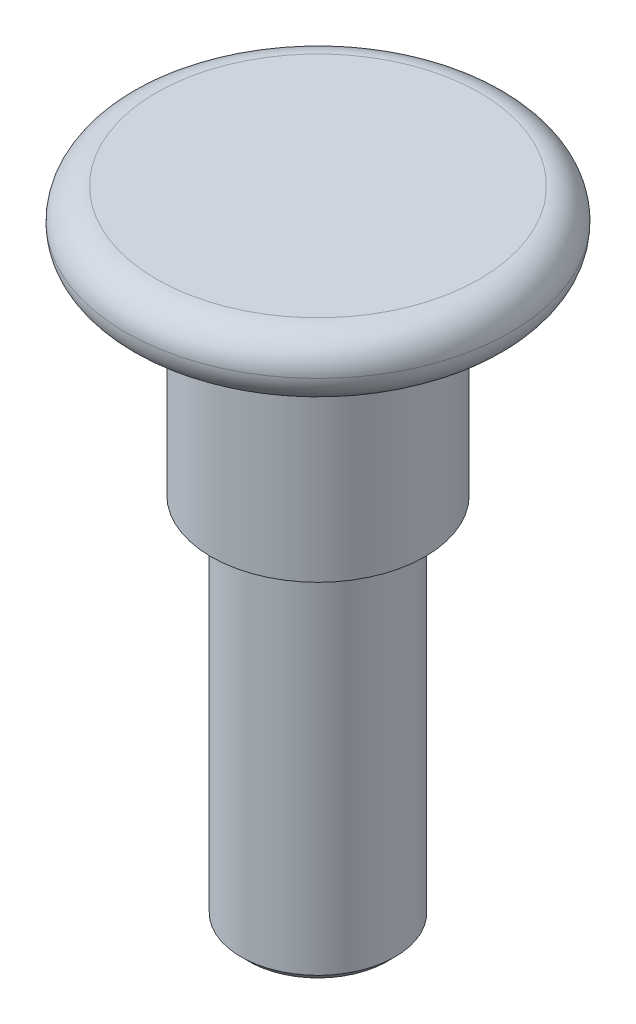
ISO-10303-21;
HEADER;
FILE_DESCRIPTION(('STEP AP214'),'2;1');
FILE_NAME('part.step','',(''),(''),'','','');
FILE_SCHEMA(('AUTOMOTIVE_DESIGN { 1 0 10303 214 1 1 1 1 }'));
ENDSEC;
DATA;
#1=APPLICATION_CONTEXT('core data for automotive mechanical design processes');
#2=APPLICATION_PROTOCOL_DEFINITION('international standard','automotive_design',2000,#1);
#3=PRODUCT_CONTEXT('',#1,'mechanical');
#4=PRODUCT('Part','Part','',(#3));
#5=PRODUCT_RELATED_PRODUCT_CATEGORY('part','',(#4));
#6=PRODUCT_DEFINITION_FORMATION('','',#4);
#7=PRODUCT_DEFINITION_CONTEXT('part definition',#1,'design');
#8=PRODUCT_DEFINITION('design','',#6,#7);
#9=PRODUCT_DEFINITION_SHAPE('','',#8);
#10=(LENGTH_UNIT() NAMED_UNIT(*) SI_UNIT(.MILLI.,.METRE.));
#11=(NAMED_UNIT(*) PLANE_ANGLE_UNIT() SI_UNIT($,.RADIAN.));
#12=(NAMED_UNIT(*) SI_UNIT($,.STERADIAN.) SOLID_ANGLE_UNIT());
#13=UNCERTAINTY_MEASURE_WITH_UNIT(LENGTH_MEASURE(1.E-05),#10,'distance_accuracy_value','');
#14=(GEOMETRIC_REPRESENTATION_CONTEXT(3) GLOBAL_UNCERTAINTY_ASSIGNED_CONTEXT((#13)) GLOBAL_UNIT_ASSIGNED_CONTEXT((#10,
#11,#12)) REPRESENTATION_CONTEXT('',''));
#15=CARTESIAN_POINT('',(0.,0.,0.));
#16=DIRECTION('',(0.,0.,1.));
#17=DIRECTION('',(1.,0.,0.));
#18=AXIS2_PLACEMENT_3D('',#15,#16,#17);
#19=CARTESIAN_POINT('',(0.,57.5016057585825,0.));
#20=DIRECTION('',(0.,1.,0.));
#21=DIRECTION('',(0.,0.,1.));
#22=AXIS2_PLACEMENT_3D('',#19,#20,#21);
#23=PLANE('',#22);
#24=CARTESIAN_POINT('',(0.,57.5016057585825,0.));
#25=DIRECTION('',(0.,1.,0.));
#26=DIRECTION('',(0.,0.,1.));
#27=AXIS2_PLACEMENT_3D('',#24,#25,#26);
#28=CIRCLE('',#27,10.5);
#29=CARTESIAN_POINT('',(0.,57.5016057585825,10.5));
#30=VERTEX_POINT('',#29);
#31=EDGE_CURVE('E42',#30,#30,#28,.T.);
#32=ORIENTED_EDGE('',*,*,#31,.T.);
#33=EDGE_LOOP('',(#32));
#34=FACE_BOUND('',#33,.T.);
#35=ADVANCED_FACE('F31',(#34),#23,.T.);
#36=CARTESIAN_POINT('',(12.5,53.5016057585825,0.));
#37=DIRECTION('',(0.,-1.,0.));
#38=DIRECTION('',(0.,0.,-1.));
#39=AXIS2_PLACEMENT_3D('',#36,#37,#38);
#40=PLANE('',#39);
#41=CARTESIAN_POINT('',(0.,53.5016057585825,0.));
#42=DIRECTION('',(0.,-1.,0.));
#43=DIRECTION('',(0.,0.,-1.));
#44=AXIS2_PLACEMENT_3D('',#41,#42,#43);
#45=CIRCLE('',#44,10.5);
#46=CARTESIAN_POINT('',(0.,53.5016057585825,-10.5));
#47=VERTEX_POINT('',#46);
#48=EDGE_CURVE('E46',#47,#47,#45,.T.);
#49=ORIENTED_EDGE('',*,*,#48,.T.);
#50=EDGE_LOOP('',(#49));
#51=FACE_BOUND('',#50,.T.);
#52=CARTESIAN_POINT('',(0.,53.5016057585825,0.));
#53=DIRECTION('',(0.,-1.,0.));
#54=DIRECTION('',(0.,0.,-1.));
#55=AXIS2_PLACEMENT_3D('',#52,#53,#54);
#56=CIRCLE('',#55,6.95);
#57=CARTESIAN_POINT('',(0.,53.5016057585825,-6.95));
#58=VERTEX_POINT('',#57);
#59=EDGE_CURVE('E55',#58,#58,#56,.T.);
#60=ORIENTED_EDGE('',*,*,#59,.F.);
#61=EDGE_LOOP('',(#60));
#62=FACE_BOUND('',#61,.T.);
#63=ADVANCED_FACE('F77',(#51,#62),#40,.T.);
#64=CARTESIAN_POINT('',(0.,-51.2852159468438,0.));
#65=DIRECTION('',(0.,-1.,0.));
#66=DIRECTION('',(0.,0.,-1.));
#67=AXIS2_PLACEMENT_3D('',#64,#65,#66);
#68=CYLINDRICAL_SURFACE('',#67,6.95);
#69=ORIENTED_EDGE('',*,*,#59,.T.);
#70=EDGE_LOOP('',(#69));
#71=FACE_BOUND('',#70,.T.);
#72=CARTESIAN_POINT('',(0.,40.1016057585825,0.));
#73=DIRECTION('',(0.,-1.,0.));
#74=DIRECTION('',(0.,0.,-1.));
#75=AXIS2_PLACEMENT_3D('',#72,#73,#74);
#76=CIRCLE('',#75,6.95);
#77=CARTESIAN_POINT('',(0.,40.1016057585825,-6.95));
#78=VERTEX_POINT('',#77);
#79=EDGE_CURVE('E58',#78,#78,#76,.T.);
#80=ORIENTED_EDGE('',*,*,#79,.F.);
#81=EDGE_LOOP('',(#80));
#82=FACE_BOUND('',#81,.T.);
#83=ADVANCED_FACE('F68',(#71,#82),#68,.T.);
#84=CARTESIAN_POINT('',(6.95,40.1016057585825,0.));
#85=DIRECTION('',(0.,-1.,0.));
#86=DIRECTION('',(0.,0.,-1.));
#87=AXIS2_PLACEMENT_3D('',#84,#85,#86);
#88=PLANE('',#87);
#89=ORIENTED_EDGE('',*,*,#79,.T.);
#90=EDGE_LOOP('',(#89));
#91=FACE_BOUND('',#90,.T.);
#92=CARTESIAN_POINT('',(0.,40.1016057585825,0.));
#93=DIRECTION('',(0.,-1.,0.));
#94=DIRECTION('',(0.,0.,-1.));
#95=AXIS2_PLACEMENT_3D('',#92,#93,#94);
#96=CIRCLE('',#95,5.);
#97=CARTESIAN_POINT('',(0.,40.1016057585825,-5.));
#98=VERTEX_POINT('',#97);
#99=EDGE_CURVE('E51',#98,#98,#96,.T.);
#100=ORIENTED_EDGE('',*,*,#99,.F.);
#101=EDGE_LOOP('',(#100));
#102=FACE_BOUND('',#101,.T.);
#103=ADVANCED_FACE('F66',(#91,#102),#88,.T.);
#104=CARTESIAN_POINT('',(0.,-51.2852159468438,0.));
#105=DIRECTION('',(0.,-1.,0.));
#106=DIRECTION('',(0.,0.,-1.));
#107=AXIS2_PLACEMENT_3D('',#104,#105,#106);
#108=CYLINDRICAL_SURFACE('',#107,5.);
#109=CARTESIAN_POINT('',(0.,16.6016057585825,0.));
#110=DIRECTION('',(0.,-1.,0.));
#111=DIRECTION('',(0.,0.,-1.));
#112=AXIS2_PLACEMENT_3D('',#109,#110,#111);
#113=CIRCLE('',#112,5.);
#114=CARTESIAN_POINT('',(0.,16.6016057585825,-5.));
#115=VERTEX_POINT('',#114);
#116=EDGE_CURVE('E10',#115,#115,#113,.F.);
#117=ORIENTED_EDGE('',*,*,#116,.T.);
#118=EDGE_LOOP('',(#117));
#119=FACE_BOUND('',#118,.T.);
#120=ORIENTED_EDGE('',*,*,#99,.T.);
#121=EDGE_LOOP('',(#120));
#122=FACE_BOUND('',#121,.T.);
#123=ADVANCED_FACE('F64',(#119,#122),#108,.T.);
#124=CARTESIAN_POINT('',(5.,16.1016057585825,0.));
#125=DIRECTION('',(0.,-1.,0.));
#126=DIRECTION('',(0.,0.,-1.));
#127=AXIS2_PLACEMENT_3D('',#124,#125,#126);
#128=PLANE('',#127);
#129=CARTESIAN_POINT('',(0.,16.1016057585825,0.));
#130=DIRECTION('',(0.,-1.,0.));
#131=DIRECTION('',(0.,0.,-1.));
#132=AXIS2_PLACEMENT_3D('',#129,#130,#131);
#133=CIRCLE('',#132,4.5);
#134=CARTESIAN_POINT('',(0.,16.1016057585825,-4.5));
#135=VERTEX_POINT('',#134);
#136=EDGE_CURVE('E38',#135,#135,#133,.T.);
#137=ORIENTED_EDGE('',*,*,#136,.T.);
#138=EDGE_LOOP('',(#137));
#139=FACE_BOUND('',#138,.T.);
#140=ADVANCED_FACE('F75',(#139),#128,.T.);
#141=CARTESIAN_POINT('',(0.,55.5016057585825,0.));
#142=DIRECTION('',(0.,1.,0.));
#143=DIRECTION('',(0.,0.,1.));
#144=AXIS2_PLACEMENT_3D('',#141,#142,#143);
#145=TOROIDAL_SURFACE('',#144,10.5,2.);
#146=ORIENTED_EDGE('',*,*,#31,.F.);
#147=EDGE_LOOP('',(#146));
#148=FACE_BOUND('',#147,.T.);
#149=CARTESIAN_POINT('',(0.,55.5016057585825,0.));
#150=DIRECTION('',(0.,1.,0.));
#151=DIRECTION('',(0.,0.,1.));
#152=AXIS2_PLACEMENT_3D('',#149,#150,#151);
#153=CIRCLE('',#152,12.5);
#154=CARTESIAN_POINT('',(0.,55.5016057585825,12.5));
#155=VERTEX_POINT('',#154);
#156=EDGE_CURVE('E49',#155,#155,#153,.F.);
#157=ORIENTED_EDGE('',*,*,#156,.F.);
#158=EDGE_LOOP('',(#157));
#159=FACE_BOUND('',#158,.T.);
#160=ADVANCED_FACE('F91',(#148,#159),#145,.T.);
#161=CARTESIAN_POINT('',(0.,55.5016057585825,0.));
#162=DIRECTION('',(0.,-1.,0.));
#163=DIRECTION('',(0.,0.,-1.));
#164=AXIS2_PLACEMENT_3D('',#161,#162,#163);
#165=TOROIDAL_SURFACE('',#164,10.5,2.);
#166=ORIENTED_EDGE('',*,*,#156,.T.);
#167=EDGE_LOOP('',(#166));
#168=FACE_BOUND('',#167,.T.);
#169=ORIENTED_EDGE('',*,*,#48,.F.);
#170=EDGE_LOOP('',(#169));
#171=FACE_BOUND('',#170,.T.);
#172=ADVANCED_FACE('F89',(#168,#171),#165,.T.);
#173=CARTESIAN_POINT('',(0.,16.1016057585825,0.));
#174=DIRECTION('',(0.,1.,0.));
#175=DIRECTION('',(0.,0.,1.));
#176=AXIS2_PLACEMENT_3D('',#173,#174,#175);
#177=CONICAL_SURFACE('',#176,4.5,0.785398163397445);
#178=ORIENTED_EDGE('',*,*,#116,.F.);
#179=EDGE_LOOP('',(#178));
#180=FACE_BOUND('',#179,.T.);
#181=ORIENTED_EDGE('',*,*,#136,.F.);
#182=EDGE_LOOP('',(#181));
#183=FACE_BOUND('',#182,.T.);
#184=ADVANCED_FACE('F33',(#180,#183),#177,.T.);
#185=CLOSED_SHELL('',(#35,#63,#83,#103,#123,#140,#160,#172,#184));
#186=MANIFOLD_SOLID_BREP('B2',#185);
#187=ADVANCED_BREP_SHAPE_REPRESENTATION('',(#18,#186),#14);
#188=SHAPE_DEFINITION_REPRESENTATION(#9,#187);
ENDSEC;
END-ISO-10303-21;
